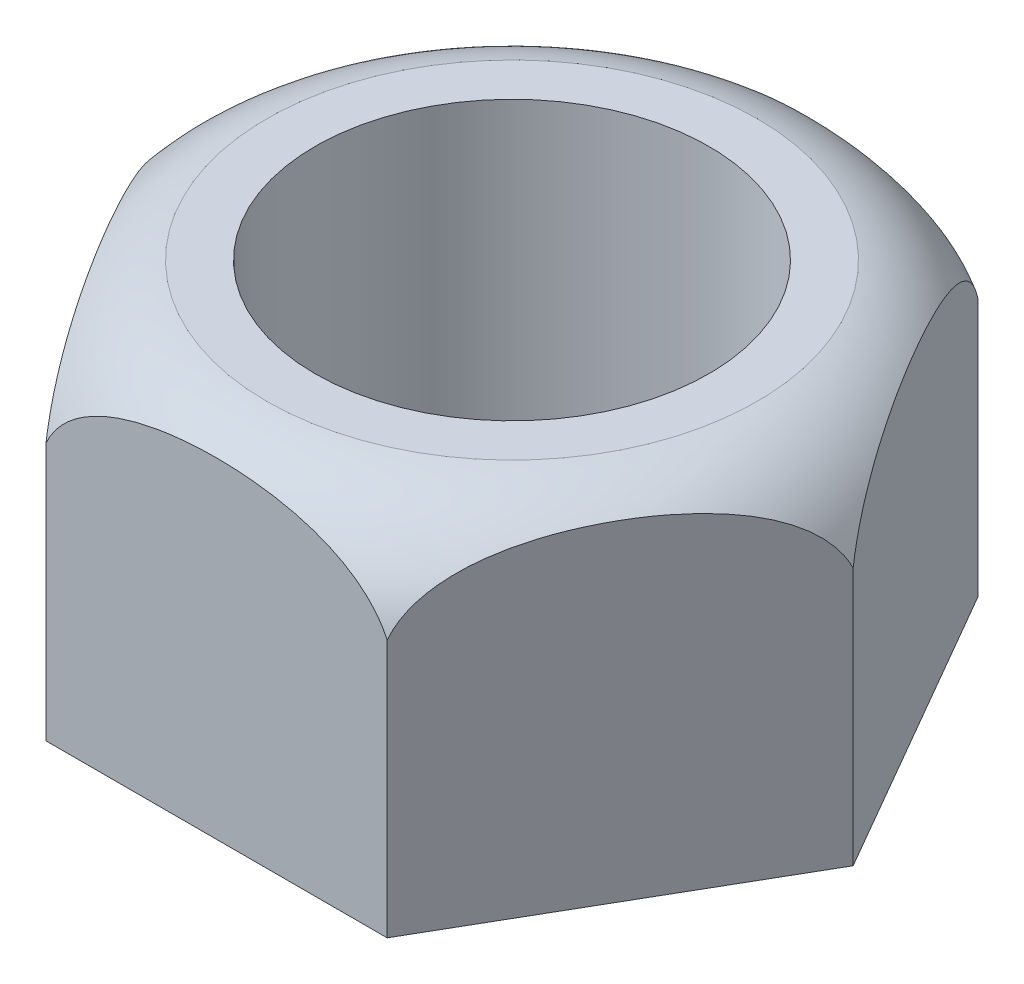
ISO-10303-21;
HEADER;
FILE_DESCRIPTION(('STEP AP214'),'2;1');
FILE_NAME('part.step','',(''),(''),'','','');
FILE_SCHEMA(('AUTOMOTIVE_DESIGN { 1 0 10303 214 1 1 1 1 }'));
ENDSEC;
DATA;
#1=APPLICATION_CONTEXT('core data for automotive mechanical design processes');
#2=APPLICATION_PROTOCOL_DEFINITION('international standard','automotive_design',2000,#1);
#3=PRODUCT_CONTEXT('',#1,'mechanical');
#4=PRODUCT('Part','Part','',(#3));
#5=PRODUCT_RELATED_PRODUCT_CATEGORY('part','',(#4));
#6=PRODUCT_DEFINITION_FORMATION('','',#4);
#7=PRODUCT_DEFINITION_CONTEXT('part definition',#1,'design');
#8=PRODUCT_DEFINITION('design','',#6,#7);
#9=PRODUCT_DEFINITION_SHAPE('','',#8);
#10=(LENGTH_UNIT() NAMED_UNIT(*) SI_UNIT(.MILLI.,.METRE.));
#11=(NAMED_UNIT(*) PLANE_ANGLE_UNIT() SI_UNIT($,.RADIAN.));
#12=(NAMED_UNIT(*) SI_UNIT($,.STERADIAN.) SOLID_ANGLE_UNIT());
#13=UNCERTAINTY_MEASURE_WITH_UNIT(LENGTH_MEASURE(1.E-05),#10,'distance_accuracy_value','');
#14=(GEOMETRIC_REPRESENTATION_CONTEXT(3) GLOBAL_UNCERTAINTY_ASSIGNED_CONTEXT((#13)) GLOBAL_UNIT_ASSIGNED_CONTEXT((#10,
#11,#12)) REPRESENTATION_CONTEXT('',''));
#15=CARTESIAN_POINT('',(0.,0.,0.));
#16=DIRECTION('',(0.,0.,1.));
#17=DIRECTION('',(1.,0.,0.));
#18=AXIS2_PLACEMENT_3D('',#15,#16,#17);
#19=CARTESIAN_POINT('',(8.24889197104677,8.55980000000001,0.));
#20=DIRECTION('',(-0.866025403784439,0.,0.5));
#21=DIRECTION('',(0.5,0.,0.866025403784439));
#22=AXIS2_PLACEMENT_3D('',#19,#20,#21);
#23=PLANE('',#22);
#24=CARTESIAN_POINT('',(8.24893575393858,6.2353386859688,7.58341931056394E-05));
#25=CARTESIAN_POINT('',(8.22543731436202,6.34284218005725,-0.0406246570520533));
#26=CARTESIAN_POINT('',(8.19665487105319,6.44500558161806,-0.0904773112289221));
#27=CARTESIAN_POINT('',(8.13104629697932,6.63684972443421,-0.204114694937019));
#28=CARTESIAN_POINT('',(8.09431397009226,6.72665757824019,-0.267736951385662));
#29=CARTESIAN_POINT('',(8.0011756518298,6.92294468194646,-0.429057250747763));
#30=CARTESIAN_POINT('',(7.94232649442226,7.0247135760561,-0.530986981360216));
#31=CARTESIAN_POINT('',(7.81719656085161,7.20888011202957,-0.747718383852292));
#32=CARTESIAN_POINT('',(7.75087802292065,7.2911721456736,-0.862585461032449));
#33=CARTESIAN_POINT('',(7.62632527114254,7.42470659858822,-1.07831715533464));
#34=CARTESIAN_POINT('',(7.56885575758391,7.47887637801377,-1.17785727270443));
#35=CARTESIAN_POINT('',(7.45176296663565,7.57705767620836,-1.38066793582684));
#36=CARTESIAN_POINT('',(7.39213829945711,7.62106249972094,-1.48394088876446));
#37=CARTESIAN_POINT('',(7.27132370311957,7.70023649655463,-1.693197907917));
#38=CARTESIAN_POINT('',(7.21013079615517,7.73538723803091,-1.79918713184217));
#39=CARTESIAN_POINT('',(7.08674468562766,7.79785403297077,-2.01289814422415));
#40=CARTESIAN_POINT('',(7.02455111380419,7.82516712903124,-2.12062057052661));
#41=CARTESIAN_POINT('',(6.84716474674997,7.89287231607991,-2.42786277083459));
#42=CARTESIAN_POINT('',(6.73118483644107,7.92507531886908,-2.62874586814686));
#43=CARTESIAN_POINT('',(6.498230529024,7.97014859052376,-3.03223456443521));
#44=CARTESIAN_POINT('',(6.38125519081207,7.98299788149749,-3.23484179345083));
#45=CARTESIAN_POINT('',(6.14725171132093,7.99091170795997,-3.6401477090774));
#46=CARTESIAN_POINT('',(6.03022368368375,7.98599020471408,-3.84284619885454));
#47=CARTESIAN_POINT('',(5.79679140375355,7.9577905849602,-4.24716276782034));
#48=CARTESIAN_POINT('',(5.68038664440031,7.93453084473649,-4.44878172526304));
#49=CARTESIAN_POINT('',(5.50917921173763,7.88435941627688,-4.74532169726819));
#50=CARTESIAN_POINT('',(5.45376667549785,7.86561150807851,-4.8412990254117));
#51=CARTESIAN_POINT('',(5.34346467364451,7.822664151612,-5.03234769679822));
#52=CARTESIAN_POINT('',(5.28857520764971,7.79846470731751,-5.12741904070155));
#53=CARTESIAN_POINT('',(5.17960339155132,7.74401975201484,-5.31616376277702));
#54=CARTESIAN_POINT('',(5.12552024708153,7.71378068141662,-5.40983851683177));
#55=CARTESIAN_POINT('',(5.01843250232996,7.64649443595172,-5.59531993160946));
#56=CARTESIAN_POINT('',(4.96542772232011,7.60944840607988,-5.68712690363053));
#57=CARTESIAN_POINT('',(4.82718703603361,7.50133527475606,-5.92656679595195));
#58=CARTESIAN_POINT('',(4.74318368815676,7.42372536292064,-6.07206486248051));
#59=CARTESIAN_POINT('',(4.58204990966602,7.24340930685432,-6.35115675364205));
#60=CARTESIAN_POINT('',(4.50491018833642,7.14073781390506,-6.48476667026669));
#61=CARTESIAN_POINT('',(4.38686599820217,6.94677531201568,-6.6892252051175));
#62=CARTESIAN_POINT('',(4.34261178651808,6.86367251031353,-6.76587574820322));
#63=CARTESIAN_POINT('',(4.26125481773306,6.68469031983388,-6.90679015168865));
#64=CARTESIAN_POINT('',(4.2241255074647,6.58886071489114,-6.97110000352344));
#65=CARTESIAN_POINT('',(4.17894908010396,6.44695017391883,-7.04934787101669));
#66=CARTESIAN_POINT('',(4.16690204315195,6.40586633669498,-7.07021395109823));
#67=CARTESIAN_POINT('',(4.1444085633627,6.32190637573708,-7.10917380093224));
#68=CARTESIAN_POINT('',(4.13396451463665,6.27902769058931,-7.12726342396249));
#69=CARTESIAN_POINT('',(4.1244022026316,6.23533868596882,-7.14382583419308));
#70=B_SPLINE_CURVE_WITH_KNOTS('',3,(#24,#25,#26,#27,#28,#29,#30,#31,#32,#33,#34,#35,#36,#37,#38,
#39,#40,#41,#42,#43,#44,#45,#46,#47,#48,#49,#50,#51,#52,#53,#54,#55,#56,#57,#58,#59,#60,#61,#62,
#63,#64,#65,#66,#67,#68,#69),.UNSPECIFIED.,.F.,.F.,(4,2,2,2,2,2,2,2,2,2,2,2,2,2,2,2,2,2,2,2,2,2,
4),(0.,0.350427425496223,0.696925865003148,1.16120912855572,1.62795495265033,2.00862154466075,
2.3895381563594,2.77124130090776,3.15308828586598,3.85455872614458,4.55678895906974,
5.25846761908035,5.95944403693531,6.29653420780221,6.63362413296263,6.97035650017381,
7.30703227758746,7.86058715263354,8.41338095029126,8.7764493662571,9.13813723410755,
9.28090011796657,9.42387419003828),.UNSPECIFIED.);
#71=CARTESIAN_POINT('',(8.24889197104677,6.23553868596881,0.));
#72=VERTEX_POINT('',#71);
#73=CARTESIAN_POINT('',(4.12444598552338,6.23553868596882,-7.14375));
#74=VERTEX_POINT('',#73);
#75=EDGE_CURVE('E104',#72,#74,#70,.T.);
#76=ORIENTED_EDGE('',*,*,#75,.F.);
#77=DIRECTION('',(0.,-1.,0.));
#78=VECTOR('',#77,1.);
#79=CARTESIAN_POINT('',(8.24889197104677,8.55980000000001,0.));
#80=LINE('',#79,#78);
#81=CARTESIAN_POINT('',(8.24889197104677,0.,0.));
#82=VERTEX_POINT('',#81);
#83=EDGE_CURVE('E76',#72,#82,#80,.T.);
#84=ORIENTED_EDGE('',*,*,#83,.T.);
#85=DIRECTION('',(-0.5,0.,-0.866025403784439));
#86=VECTOR('',#85,1.);
#87=CARTESIAN_POINT('',(8.24889197104677,0.,0.));
#88=LINE('',#87,#86);
#89=CARTESIAN_POINT('',(4.12444598552339,0.,-7.14375));
#90=VERTEX_POINT('',#89);
#91=EDGE_CURVE('E121',#82,#90,#88,.T.);
#92=ORIENTED_EDGE('',*,*,#91,.T.);
#93=DIRECTION('',(0.,-1.,0.));
#94=VECTOR('',#93,1.);
#95=CARTESIAN_POINT('',(4.12444598552339,8.55980000000001,-7.14375000000002));
#96=LINE('',#95,#94);
#97=EDGE_CURVE('E13',#74,#90,#96,.T.);
#98=ORIENTED_EDGE('',*,*,#97,.F.);
#99=EDGE_LOOP('',(#76,#84,#92,#98));
#100=FACE_BOUND('',#99,.T.);
#101=ADVANCED_FACE('F53',(#100),#23,.F.);
#102=CARTESIAN_POINT('',(4.12444598552339,8.55980000000001,-7.14375000000002));
#103=DIRECTION('',(0.,0.,1.));
#104=DIRECTION('',(1.,0.,0.));
#105=AXIS2_PLACEMENT_3D('',#102,#103,#104);
#106=PLANE('',#105);
#107=CARTESIAN_POINT('',(0.,7.98826677982349,-7.14374999999999));
#108=CARTESIAN_POINT('',(-0.187450549647373,7.98826978687154,-7.14374999999999));
#109=CARTESIAN_POINT('',(-0.374910324300697,7.98256531091271,-7.14375000000001));
#110=CARTESIAN_POINT('',(-0.749187788216499,7.95928749417737,-7.14375000000002));
#111=CARTESIAN_POINT('',(-0.936005171621026,7.94170912331662,-7.14375000000002));
#112=CARTESIAN_POINT('',(-1.30728057161959,7.89336853579566,-7.14375000000002));
#113=CARTESIAN_POINT('',(-1.49174469606105,7.86265447480424,-7.14375000000002));
#114=CARTESIAN_POINT('',(-1.8573336101827,7.78576768336265,-7.14375000000001));
#115=CARTESIAN_POINT('',(-2.03846155151695,7.7396104254909,-7.14375));
#116=CARTESIAN_POINT('',(-2.37670748942257,7.63427716984391,-7.14375000000001));
#117=CARTESIAN_POINT('',(-2.53438205129545,7.57692306257758,-7.14375000000002));
#118=CARTESIAN_POINT('',(-2.84233957711975,7.44406885307009,-7.14375000000002));
#119=CARTESIAN_POINT('',(-2.99261270246027,7.36854534317949,-7.14375));
#120=CARTESIAN_POINT('',(-3.28272071815591,7.19489089457452,-7.14375000000001));
#121=CARTESIAN_POINT('',(-3.42237544590105,7.09645188243693,-7.14375000000002));
#122=CARTESIAN_POINT('',(-3.6803274105844,6.87471285879841,-7.14375000000001));
#123=CARTESIAN_POINT('',(-3.79871170680939,6.75151877260037,-7.14374999999998));
#124=CARTESIAN_POINT('',(-3.96034644709604,6.53640293720515,-7.14375));
#125=CARTESIAN_POINT('',(-4.01442687780075,6.45260243686396,-7.14375000000002));
#126=CARTESIAN_POINT('',(-4.10845933792733,6.27734934664688,-7.14375000000002));
#127=CARTESIAN_POINT('',(-4.14842022162116,6.1859015969683,-7.14374999999999));
#128=CARTESIAN_POINT('',(-4.21175763921705,5.99661067114806,-7.14374999999999));
#129=CARTESIAN_POINT('',(-4.23501192779827,5.89872596196194,-7.14375000000001));
#130=CARTESIAN_POINT('',(-4.26253096229258,5.70031535148988,-7.14375000000002));
#131=CARTESIAN_POINT('',(-4.26680559455275,5.59979085270586,-7.14375000000002));
#132=CARTESIAN_POINT('',(-4.25659283454024,5.41025176749444,-7.14375000000002));
#133=CARTESIAN_POINT('',(-4.24401087139935,5.32112764040986,-7.14375000000002));
#134=CARTESIAN_POINT('',(-4.20423516607436,5.14623201998094,-7.14375000000001));
#135=CARTESIAN_POINT('',(-4.17704028962077,5.06046078744623,-7.14374999999999));
#136=CARTESIAN_POINT('',(-4.10923582708162,4.89304123010996,-7.14374999999999));
#137=CARTESIAN_POINT('',(-4.06844154483803,4.81146858518673,-7.14375000000002));
#138=CARTESIAN_POINT('',(-3.97568924339239,4.65499212726519,-7.14375000000002));
#139=CARTESIAN_POINT('',(-3.9237259154134,4.58009150958824,-7.14375));
#140=CARTESIAN_POINT('',(-3.78063651602825,4.39952039055839,-7.14374999999998));
#141=CARTESIAN_POINT('',(-3.68338739957913,4.29869313102764,-7.14375000000001));
#142=CARTESIAN_POINT('',(-3.47412454834483,4.11379710595111,-7.14375000000002));
#143=CARTESIAN_POINT('',(-3.36207605957143,4.02976899572282,-7.14375));
#144=CARTESIAN_POINT('',(-3.0627288839129,3.83438357702667,-7.14374999999998));
#145=CARTESIAN_POINT('',(-2.86832437870103,3.7339344685416,-7.14375000000001));
#146=CARTESIAN_POINT('',(-2.56751107791536,3.60600198096798,-7.14375000000002));
#147=CARTESIAN_POINT('',(-2.46554071511294,3.56710556082647,-7.14375000000002));
#148=CARTESIAN_POINT('',(-2.25926239304128,3.49607082452517,-7.14375000000001));
#149=CARTESIAN_POINT('',(-2.15495491765644,3.46393112347844,-7.14375000000001));
#150=CARTESIAN_POINT('',(-1.85646165034079,3.38121509380417,-7.14375));
#151=CARTESIAN_POINT('',(-1.66029689436215,3.33779621306887,-7.14375000000001));
#152=CARTESIAN_POINT('',(-1.2649531223277,3.26761827499379,-7.14375000000002));
#153=CARTESIAN_POINT('',(-1.06577140977583,3.24087514699284,-7.14375000000002));
#154=CARTESIAN_POINT('',(-0.665398863769086,3.2016647578887,-7.14375000000002));
#155=CARTESIAN_POINT('',(-0.464203644380809,3.18924338203855,-7.14375000000002));
#156=CARTESIAN_POINT('',(-0.061535691626735,3.17767545177597,-7.14375000000001));
#157=CARTESIAN_POINT('',(0.139936868343673,3.17852270307074,-7.14375));
#158=CARTESIAN_POINT('',(0.514673778480569,3.19253465283143,-7.14375000000001));
#159=CARTESIAN_POINT('',(0.68800269309396,3.20398739178078,-7.14375000000001));
#160=CARTESIAN_POINT('',(1.03369925188393,3.23762832251236,-7.14375000000002));
#161=CARTESIAN_POINT('',(1.20606657860937,3.25981986928367,-7.14375000000002));
#162=CARTESIAN_POINT('',(1.54794259280948,3.31626993935381,-7.14375000000002));
#163=CARTESIAN_POINT('',(1.71746145081384,3.35046549974604,-7.14375000000002));
#164=CARTESIAN_POINT('',(2.0529284063107,3.43306104826712,-7.14375000000001));
#165=CARTESIAN_POINT('',(2.21887965055034,3.48144791692585,-7.14375));
#166=CARTESIAN_POINT('',(2.53511701799457,3.5918270786776,-7.14375000000001));
#167=CARTESIAN_POINT('',(2.68574426303233,3.65282270707492,-7.14375000000002));
#168=CARTESIAN_POINT('',(2.97890903777817,3.79282718602654,-7.14375000000001));
#169=CARTESIAN_POINT('',(3.12143244985582,3.8718663374456,-7.14374999999999));
#170=CARTESIAN_POINT('',(3.39502946720028,4.05220229060833,-7.14374999999999));
#171=CARTESIAN_POINT('',(3.52590055724988,4.15381352798369,-7.14375000000002));
#172=CARTESIAN_POINT('',(3.76506602463691,4.38079457551077,-7.14375000000001));
#173=CARTESIAN_POINT('',(3.8734581924831,4.50605674493859,-7.14374999999998));
#174=CARTESIAN_POINT('',(4.01887497456291,4.72320904000138,-7.14375));
#175=CARTESIAN_POINT('',(4.06694109544633,4.8077312051497,-7.14375000000002));
#176=CARTESIAN_POINT('',(4.14871857694964,4.98351334409123,-7.14375000000002));
#177=CARTESIAN_POINT('',(4.18243906802213,5.07476898874272,-7.14374999999999));
#178=CARTESIAN_POINT('',(4.23336649612648,5.26243902257045,-7.14374999999999));
#179=CARTESIAN_POINT('',(4.25047167383781,5.35888142992725,-7.14375000000001));
#180=CARTESIAN_POINT('',(4.26641678303021,5.55326868590939,-7.14375000000003));
#181=CARTESIAN_POINT('',(4.26526260562955,5.65121303976491,-7.14375000000003));
#182=CARTESIAN_POINT('',(4.24572907120983,5.83650792205007,-7.14375000000003));
#183=CARTESIAN_POINT('',(4.22888879467324,5.92402669823055,-7.14375000000002));
#184=CARTESIAN_POINT('',(4.18129073440122,6.09516135910205,-7.14375000000001));
#185=CARTESIAN_POINT('',(4.15053093874884,6.17877667766217,-7.14375000000002));
#186=CARTESIAN_POINT('',(4.07539142344497,6.34364223001864,-7.14375000000002));
#187=CARTESIAN_POINT('',(4.03051676584605,6.4246645975472,-7.14375000000002));
#188=CARTESIAN_POINT('',(3.92990596289553,6.57959828401815,-7.14375000000001));
#189=CARTESIAN_POINT('',(3.87416475750376,6.65350626608334,-7.14375000000001));
#190=CARTESIAN_POINT('',(3.71928067002685,6.8343212868521,-7.14375));
#191=CARTESIAN_POINT('',(3.6136481874203,6.9356744119349,-7.14375000000001));
#192=CARTESIAN_POINT('',(3.38766084845949,7.12044414580638,-7.14375000000002));
#193=CARTESIAN_POINT('',(3.26726683276439,7.20381135331698,-7.14375000000002));
#194=CARTESIAN_POINT('',(3.04258397701966,7.33888254375397,-7.14375000000002));
#195=CARTESIAN_POINT('',(2.94005071009194,7.39357416394237,-7.14375000000002));
#196=CARTESIAN_POINT('',(2.73057206469072,7.49383522356814,-7.14375000000002));
#197=CARTESIAN_POINT('',(2.6236239034841,7.53939880030518,-7.14375000000002));
#198=CARTESIAN_POINT('',(2.40654432821649,7.62244934455349,-7.14375000000002));
#199=CARTESIAN_POINT('',(2.29640966989799,7.65992772681686,-7.14375000000003));
#200=CARTESIAN_POINT('',(2.0739415491051,7.72770241593209,-7.14375000000001));
#201=CARTESIAN_POINT('',(1.96160742633742,7.75799652909132,-7.14374999999998));
#202=CARTESIAN_POINT('',(1.69762143901033,7.82127208433199,-7.14374999999997));
#203=CARTESIAN_POINT('',(1.54537565519149,7.85176833260344,-7.14375000000001));
#204=CARTESIAN_POINT('',(1.2392445544688,7.90296896695416,-7.14375000000003));
#205=CARTESIAN_POINT('',(1.08535878328987,7.92367056382813,-7.14375000000002));
#206=CARTESIAN_POINT('',(0.776423707731591,7.95639447172694,-7.14375000000002));
#207=CARTESIAN_POINT('',(0.621372902542476,7.96840240645042,-7.14375000000002));
#208=CARTESIAN_POINT('',(0.310883487472762,7.98433693201041,-7.14375000000001));
#209=CARTESIAN_POINT('',(0.155444915612855,7.98826428620408,-7.14374999999999));
#210=CARTESIAN_POINT('',(0.,7.98826677982349,-7.14374999999999));
#211=B_SPLINE_CURVE_WITH_KNOTS('',3,(#107,#108,#109,#110,#111,#112,#113,#114,#115,#116,#117,
#118,#119,#120,#121,#122,#123,#124,#125,#126,#127,#128,#129,#130,#131,#132,#133,#134,#135,#136,
#137,#138,#139,#140,#141,#142,#143,#144,#145,#146,#147,#148,#149,#150,#151,#152,#153,#154,#155,
#156,#157,#158,#159,#160,#161,#162,#163,#164,#165,#166,#167,#168,#169,#170,#171,#172,#173,#174,
#175,#176,#177,#178,#179,#180,#181,#182,#183,#184,#185,#186,#187,#188,#189,#190,#191,#192,#193,
#194,#195,#196,#197,#198,#199,#200,#201,#202,#203,#204,#205,#206,#207,#208,#209,#210),
.UNSPECIFIED.,.T.,.F.,(4,2,2,2,2,2,2,2,2,2,2,2,2,2,2,2,2,2,2,2,2,2,2,2,2,2,2,2,2,2,2,2,2,2,2,2,
2,2,2,2,2,2,2,2,2,2,2,2,2,2,2,4),(0.,0.562276773874726,1.12479189201568,1.68526226253245,
2.2451727695548,2.74762945260232,3.25073695023035,3.76104456888429,4.26921341232884,
4.56733824855503,4.86527579952955,5.16537180666401,5.46531147790057,5.73405049235294,
6.00281036962016,6.27538006550789,6.54807960456275,6.96593412037132,7.38478795271826,
8.03732795384406,8.36461168650558,8.69182827210727,9.29359771444631,9.89594111368379,
10.5002090360968,11.1041948719927,11.6250223461323,12.1460126409254,12.6643101157375,
13.1821299411963,13.6687167456039,14.1561267760512,14.6508076441783,15.1432891297037,
15.4338963387268,15.7243183094967,16.016507940147,16.3086033019393,16.5747541716581,
16.840943522919,17.1177651044929,17.3947158980907,17.8314050938777,18.2692788742151,
18.617420458891,18.9657849338277,19.3145175177455,19.6633564492839,20.1287725950262,
20.5943211968381,21.0606379069887,21.5269105630596),.UNSPECIFIED.);
#212=CARTESIAN_POINT('',(-4.12444598552338,6.23553868596882,-7.14374999999999));
#213=VERTEX_POINT('',#212);
#214=EDGE_CURVE('E107',#74,#213,#211,.T.);
#215=ORIENTED_EDGE('',*,*,#214,.F.);
#216=ORIENTED_EDGE('',*,*,#97,.T.);
#217=DIRECTION('',(-1.,0.,0.));
#218=VECTOR('',#217,1.);
#219=CARTESIAN_POINT('',(4.12444598552339,0.,-7.14375));
#220=LINE('',#219,#218);
#221=CARTESIAN_POINT('',(-4.12444598552338,0.,-7.14374999999999));
#222=VERTEX_POINT('',#221);
#223=EDGE_CURVE('E124',#90,#222,#220,.T.);
#224=ORIENTED_EDGE('',*,*,#223,.T.);
#225=DIRECTION('',(0.,-1.,0.));
#226=VECTOR('',#225,1.);
#227=CARTESIAN_POINT('',(-4.12444598552339,8.55980000000001,-7.14374999999999));
#228=LINE('',#227,#226);
#229=EDGE_CURVE('E61',#213,#222,#228,.T.);
#230=ORIENTED_EDGE('',*,*,#229,.F.);
#231=EDGE_LOOP('',(#215,#216,#224,#230));
#232=FACE_BOUND('',#231,.T.);
#233=ADVANCED_FACE('F115',(#232),#106,.F.);
#234=CARTESIAN_POINT('',(-4.12444598552339,8.55980000000001,-7.14374999999999));
#235=DIRECTION('',(0.866025403784439,0.,0.5));
#236=DIRECTION('',(0.5,0.,-0.866025403784439));
#237=AXIS2_PLACEMENT_3D('',#234,#235,#236);
#238=PLANE('',#237);
#239=CARTESIAN_POINT('',(-4.1244022026316,6.23533868596882,-7.1438258341931));
#240=CARTESIAN_POINT('',(-4.14790064220815,6.34284218005723,-7.1031253429479));
#241=CARTESIAN_POINT('',(-4.17668308551697,6.44500558161804,-7.05327268877104));
#242=CARTESIAN_POINT('',(-4.24229165959083,6.63684972443421,-6.93963530506298));
#243=CARTESIAN_POINT('',(-4.2790239864779,6.72665757824021,-6.87601304861438));
#244=CARTESIAN_POINT('',(-4.37216230474035,6.92294468194647,-6.71469274925229));
#245=CARTESIAN_POINT('',(-4.43101146214789,7.02471357605608,-6.6127630186398));
#246=CARTESIAN_POINT('',(-4.55614139571853,7.20888011202955,-6.39603161614771));
#247=CARTESIAN_POINT('',(-4.62245993364952,7.2911721456736,-6.28116453896758));
#248=CARTESIAN_POINT('',(-4.74701268542762,7.42470659858822,-6.0654328446654));
#249=CARTESIAN_POINT('',(-4.80448219898623,7.47887637801375,-5.96589272729559));
#250=CARTESIAN_POINT('',(-4.92157498993449,7.57705767620834,-5.76308206417317));
#251=CARTESIAN_POINT('',(-4.98119965711303,7.62106249972092,-5.65980911123556));
#252=CARTESIAN_POINT('',(-5.10201425345057,7.70023649655462,-5.45055209208301));
#253=CARTESIAN_POINT('',(-5.16320716041496,7.73538723803089,-5.34456286815784));
#254=CARTESIAN_POINT('',(-5.28659327094248,7.79785403297076,-5.13085185577587));
#255=CARTESIAN_POINT('',(-5.34878684276597,7.82516712903124,-5.02312942947342));
#256=CARTESIAN_POINT('',(-5.52617320982019,7.89287231607991,-4.71588722916544));
#257=CARTESIAN_POINT('',(-5.64215312012908,7.92507531886907,-4.51500413185316));
#258=CARTESIAN_POINT('',(-5.87510742754613,7.97014859052375,-4.1115154355648));
#259=CARTESIAN_POINT('',(-5.99208276575807,7.98299788149748,-3.90890820654917));
#260=CARTESIAN_POINT('',(-6.22608624524922,7.99091170795997,-3.5036022909226));
#261=CARTESIAN_POINT('',(-6.34311427288638,7.98599020471407,-3.30090380114545));
#262=CARTESIAN_POINT('',(-6.57654655281662,7.95779058496019,-2.89658723217966));
#263=CARTESIAN_POINT('',(-6.6929513121699,7.9345308447365,-2.69496827473697));
#264=CARTESIAN_POINT('',(-6.86415874483256,7.88435941627688,-2.39842830273181));
#265=CARTESIAN_POINT('',(-6.91957128107232,7.86561150807851,-2.30245097458829));
#266=CARTESIAN_POINT('',(-7.02987328292564,7.82266415161199,-2.11140230320176));
#267=CARTESIAN_POINT('',(-7.08476274892045,7.7984647073175,-2.01633095929843));
#268=CARTESIAN_POINT('',(-7.19373456501884,7.74401975201483,-1.82758623722297));
#269=CARTESIAN_POINT('',(-7.24781770948862,7.71378068141661,-1.73391148316822));
#270=CARTESIAN_POINT('',(-7.35490545424019,7.64649443595172,-1.54843006839052));
#271=CARTESIAN_POINT('',(-7.40791023425004,7.60944840607988,-1.45662309636946));
#272=CARTESIAN_POINT('',(-7.54615092053655,7.50133527475606,-1.21718320404804));
#273=CARTESIAN_POINT('',(-7.63015426841337,7.42372536292063,-1.07168513751948));
#274=CARTESIAN_POINT('',(-7.79128804690414,7.24340930685431,-0.792593246357952));
#275=CARTESIAN_POINT('',(-7.86842776823378,7.14073781390505,-0.658983329733329));
#276=CARTESIAN_POINT('',(-7.986471958368,6.94677531201565,-0.454524794882514));
#277=CARTESIAN_POINT('',(-8.03072617005206,6.86367251031349,-0.377874251796786));
#278=CARTESIAN_POINT('',(-8.11208313883711,6.68469031983386,-0.236959848311315));
#279=CARTESIAN_POINT('',(-8.14921244910552,6.58886071489116,-0.172649996476486));
#280=CARTESIAN_POINT('',(-8.19438887646622,6.44695017391881,-0.0944021289832702));
#281=CARTESIAN_POINT('',(-8.20643591341821,6.40586633669495,-0.0735360489017477));
#282=CARTESIAN_POINT('',(-8.22892939320744,6.32190637573705,-0.0345761990677584));
#283=CARTESIAN_POINT('',(-8.2393734419335,6.27902769058928,-0.0164865760375078));
#284=CARTESIAN_POINT('',(-8.24893575393861,6.23533868596882,7.58341931195172E-05));
#285=B_SPLINE_CURVE_WITH_KNOTS('',3,(#239,#240,#241,#242,#243,#244,#245,#246,#247,#248,#249,
#250,#251,#252,#253,#254,#255,#256,#257,#258,#259,#260,#261,#262,#263,#264,#265,#266,#267,#268,
#269,#270,#271,#272,#273,#274,#275,#276,#277,#278,#279,#280,#281,#282,#283,#284),.UNSPECIFIED.,
.F.,.F.,(4,2,2,2,2,2,2,2,2,2,2,2,2,2,2,2,2,2,2,2,2,2,4),(0.,0.350427425496208,0.69692586500311,
1.16120912855568,1.62795495265029,2.0086215446607,2.38953815635936,2.77124130090772,
3.15308828586594,3.85455872614454,4.55678895906971,5.25846761908034,5.9594440369353,
6.29653420780221,6.63362413296263,6.9703565001738,7.30703227758745,7.86058715263352,
8.41338095029124,8.7764493662571,9.13813723410758,9.28090011796659,9.42387419003828),.UNSPECIFIED.);
#286=CARTESIAN_POINT('',(-8.24889197104679,6.23553868596881,0.));
#287=VERTEX_POINT('',#286);
#288=EDGE_CURVE('E118',#213,#287,#285,.T.);
#289=ORIENTED_EDGE('',*,*,#288,.F.);
#290=ORIENTED_EDGE('',*,*,#229,.T.);
#291=DIRECTION('',(-0.5,0.,0.866025403784439));
#292=VECTOR('',#291,1.);
#293=CARTESIAN_POINT('',(-4.12444598552338,0.,-7.14374999999999));
#294=LINE('',#293,#292);
#295=CARTESIAN_POINT('',(-8.24889197104678,0.,0.));
#296=VERTEX_POINT('',#295);
#297=EDGE_CURVE('E127',#222,#296,#294,.T.);
#298=ORIENTED_EDGE('',*,*,#297,.T.);
#299=DIRECTION('',(0.,-1.,0.));
#300=VECTOR('',#299,1.);
#301=CARTESIAN_POINT('',(-8.24889197104679,8.55980000000001,0.));
#302=LINE('',#301,#300);
#303=EDGE_CURVE('E148',#287,#296,#302,.T.);
#304=ORIENTED_EDGE('',*,*,#303,.F.);
#305=EDGE_LOOP('',(#289,#290,#298,#304));
#306=FACE_BOUND('',#305,.T.);
#307=ADVANCED_FACE('F150',(#306),#238,.F.);
#308=CARTESIAN_POINT('',(-8.24889197104679,8.55980000000001,0.));
#309=DIRECTION('',(0.86602540378444,0.,-0.500000000000001));
#310=DIRECTION('',(-0.500000000000001,0.,-0.86602540378444));
#311=AXIS2_PLACEMENT_3D('',#308,#309,#310);
#312=PLANE('',#311);
#313=CARTESIAN_POINT('',(-8.24893575393859,6.2353386859688,-7.58341930640061E-05));
#314=CARTESIAN_POINT('',(-8.22543731436202,6.34284218005723,0.0406246570521057));
#315=CARTESIAN_POINT('',(-8.19665487105318,6.44500558161804,0.090477311228966));
#316=CARTESIAN_POINT('',(-8.13104629697933,6.6368497244342,0.204114694937039));
#317=CARTESIAN_POINT('',(-8.09431397009228,6.72665757824019,0.267736951385666));
#318=CARTESIAN_POINT('',(-8.00117565182983,6.92294468194646,0.429057250747758));
#319=CARTESIAN_POINT('',(-7.94232649442228,7.02471357605606,0.530986981360229));
#320=CARTESIAN_POINT('',(-7.81719656085163,7.20888011202954,0.747718383852288));
#321=CARTESIAN_POINT('',(-7.75087802292066,7.2911721456736,0.862585461032413));
#322=CARTESIAN_POINT('',(-7.62632527114257,7.42470659858822,1.0783171553346));
#323=CARTESIAN_POINT('',(-7.56885575758394,7.47887637801374,1.1778572727044));
#324=CARTESIAN_POINT('',(-7.45176296663568,7.57705767620832,1.38066793582682));
#325=CARTESIAN_POINT('',(-7.39213829945715,7.62106249972091,1.48394088876443));
#326=CARTESIAN_POINT('',(-7.27132370311961,7.70023649655461,1.69319790791698));
#327=CARTESIAN_POINT('',(-7.21013079615521,7.73538723803088,1.79918713184215));
#328=CARTESIAN_POINT('',(-7.08674468562769,7.79785403297075,2.01289814422412));
#329=CARTESIAN_POINT('',(-7.02455111380421,7.82516712903123,2.12062057052657));
#330=CARTESIAN_POINT('',(-6.84716474674999,7.89287231607992,2.42786277083454));
#331=CARTESIAN_POINT('',(-6.7311848364411,7.92507531886907,2.62874586814682));
#332=CARTESIAN_POINT('',(-6.49823052902404,7.97014859052373,3.03223456443518));
#333=CARTESIAN_POINT('',(-6.38125519081211,7.98299788149747,3.23484179345081));
#334=CARTESIAN_POINT('',(-6.14725171132096,7.99091170795996,3.64014770907737));
#335=CARTESIAN_POINT('',(-6.03022368368379,7.98599020471406,3.84284619885452));
#336=CARTESIAN_POINT('',(-5.79679140375357,7.95779058496019,4.24716276782032));
#337=CARTESIAN_POINT('',(-5.68038664440031,7.9345308447365,4.44878172526301));
#338=CARTESIAN_POINT('',(-5.50917921173764,7.88435941627688,4.74532169726817));
#339=CARTESIAN_POINT('',(-5.45376667549788,7.86561150807851,4.84129902541169));
#340=CARTESIAN_POINT('',(-5.34346467364454,7.82266415161198,5.03234769679821));
#341=CARTESIAN_POINT('',(-5.28857520764974,7.7984647073175,5.12741904070155));
#342=CARTESIAN_POINT('',(-5.17960339155134,7.74401975201483,5.31616376277702));
#343=CARTESIAN_POINT('',(-5.12552024708155,7.7137806814166,5.40983851683177));
#344=CARTESIAN_POINT('',(-5.01843250232998,7.64649443595171,5.59531993160948));
#345=CARTESIAN_POINT('',(-4.96542772232014,7.60944840607988,5.68712690363056));
#346=CARTESIAN_POINT('',(-4.82718703603365,7.50133527475607,5.92656679595197));
#347=CARTESIAN_POINT('',(-4.7431836881568,7.42372536292063,6.07206486248051));
#348=CARTESIAN_POINT('',(-4.58204990966605,7.2434093068543,6.35115675364202));
#349=CARTESIAN_POINT('',(-4.50491018833643,7.14073781390505,6.48476667026665));
#350=CARTESIAN_POINT('',(-4.38686599820219,6.94677531201567,6.68922520511746));
#351=CARTESIAN_POINT('',(-4.34261178651811,6.86367251031352,6.76587574820318));
#352=CARTESIAN_POINT('',(-4.26125481773309,6.68469031983387,6.90679015168867));
#353=CARTESIAN_POINT('',(-4.22412550746473,6.58886071489117,6.97110000352351));
#354=CARTESIAN_POINT('',(-4.17894908010399,6.44695017391882,7.04934787101672));
#355=CARTESIAN_POINT('',(-4.16690204315198,6.40586633669496,7.07021395109823));
#356=CARTESIAN_POINT('',(-4.14440856336273,6.32190637573705,7.10917380093222));
#357=CARTESIAN_POINT('',(-4.13396451463667,6.27902769058928,7.12726342396248));
#358=CARTESIAN_POINT('',(-4.12440220263161,6.23533868596882,7.14382583419312));
#359=B_SPLINE_CURVE_WITH_KNOTS('',3,(#313,#314,#315,#316,#317,#318,#319,#320,#321,#322,#323,
#324,#325,#326,#327,#328,#329,#330,#331,#332,#333,#334,#335,#336,#337,#338,#339,#340,#341,#342,
#343,#344,#345,#346,#347,#348,#349,#350,#351,#352,#353,#354,#355,#356,#357,#358),.UNSPECIFIED.,
.F.,.F.,(4,2,2,2,2,2,2,2,2,2,2,2,2,2,2,2,2,2,2,2,2,2,4),(0.,0.350427425496212,0.696925865003123,
1.16120912855567,1.62795495265027,2.00862154466068,2.38953815635933,2.77124130090769,
3.15308828586592,3.85455872614451,4.55678895906967,5.25846761908029,5.95944403693525,
6.29653420780216,6.6336241329626,6.97035650017378,7.30703227758744,7.86058715263349,
8.41338095029119,8.77644936625705,9.13813723410752,9.28090011796654,9.42387419003825),.UNSPECIFIED.);
#360=CARTESIAN_POINT('',(-4.1244459855234,6.23553868596881,7.14375000000003));
#361=VERTEX_POINT('',#360);
#362=EDGE_CURVE('E160',#287,#361,#359,.T.);
#363=ORIENTED_EDGE('',*,*,#362,.F.);
#364=ORIENTED_EDGE('',*,*,#303,.T.);
#365=DIRECTION('',(0.500000000000001,0.,0.86602540378444));
#366=VECTOR('',#365,1.);
#367=CARTESIAN_POINT('',(-8.24889197104678,0.,0.));
#368=LINE('',#367,#366);
#369=CARTESIAN_POINT('',(-4.12444598552341,0.,7.14375000000003));
#370=VERTEX_POINT('',#369);
#371=EDGE_CURVE('E135',#296,#370,#368,.T.);
#372=ORIENTED_EDGE('',*,*,#371,.T.);
#373=DIRECTION('',(0.,-1.,0.));
#374=VECTOR('',#373,1.);
#375=CARTESIAN_POINT('',(-4.1244459855234,8.55980000000001,7.14375000000003));
#376=LINE('',#375,#374);
#377=EDGE_CURVE('E146',#361,#370,#376,.T.);
#378=ORIENTED_EDGE('',*,*,#377,.F.);
#379=EDGE_LOOP('',(#363,#364,#372,#378));
#380=FACE_BOUND('',#379,.T.);
#381=ADVANCED_FACE('F159',(#380),#312,.F.);
#382=CARTESIAN_POINT('',(-4.1244459855234,8.55980000000001,7.14375000000003));
#383=DIRECTION('',(0.,0.,-1.));
#384=DIRECTION('',(-1.,0.,0.));
#385=AXIS2_PLACEMENT_3D('',#382,#383,#384);
#386=PLANE('',#385);
#387=CARTESIAN_POINT('',(0.,7.98826677982349,7.14375));
#388=CARTESIAN_POINT('',(0.18745054964738,7.98826978687154,7.14375));
#389=CARTESIAN_POINT('',(0.374910324300704,7.9825653109127,7.14375000000002));
#390=CARTESIAN_POINT('',(0.749187788216507,7.95928749417736,7.14375000000004));
#391=CARTESIAN_POINT('',(0.936005171621035,7.94170912331661,7.14375000000003));
#392=CARTESIAN_POINT('',(1.3072805716196,7.89336853579564,7.14375000000003));
#393=CARTESIAN_POINT('',(1.49174469606107,7.86265447480423,7.14375000000004));
#394=CARTESIAN_POINT('',(1.85733361018272,7.78576768336264,7.14375000000002));
#395=CARTESIAN_POINT('',(2.03846155151698,7.73961042549091,7.14375));
#396=CARTESIAN_POINT('',(2.37670748942259,7.6342771698439,7.14375000000001));
#397=CARTESIAN_POINT('',(2.53438205129546,7.57692306257755,7.14375000000004));
#398=CARTESIAN_POINT('',(2.84233957711977,7.44406885307007,7.14375000000002));
#399=CARTESIAN_POINT('',(2.9926127024603,7.36854534317949,7.14374999999996));
#400=CARTESIAN_POINT('',(3.28272071815594,7.19489089457452,7.14374999999996));
#401=CARTESIAN_POINT('',(3.42237544590105,7.09645188243691,7.14375000000002));
#402=CARTESIAN_POINT('',(3.68032741058439,6.87471285879838,7.14375000000004));
#403=CARTESIAN_POINT('',(3.79871170680939,6.75151877260037,7.14375));
#404=CARTESIAN_POINT('',(3.96034644709602,6.53640293720515,7.14375000000001));
#405=CARTESIAN_POINT('',(4.01442687780073,6.45260243686396,7.14375000000003));
#406=CARTESIAN_POINT('',(4.10845933792731,6.27734934664688,7.14375000000003));
#407=CARTESIAN_POINT('',(4.14842022162115,6.1859015969683,7.14375));
#408=CARTESIAN_POINT('',(4.21175763921702,5.99661067114806,7.14375));
#409=CARTESIAN_POINT('',(4.23501192779824,5.89872596196194,7.14375000000003));
#410=CARTESIAN_POINT('',(4.26253096229256,5.70031535148988,7.14375000000003));
#411=CARTESIAN_POINT('',(4.26680559455277,5.59979085270586,7.14375));
#412=CARTESIAN_POINT('',(4.25659283454026,5.41025176749444,7.14375000000001));
#413=CARTESIAN_POINT('',(4.24401087139933,5.32112764040987,7.14375000000003));
#414=CARTESIAN_POINT('',(4.20423516607432,5.14623201998094,7.14375000000003));
#415=CARTESIAN_POINT('',(4.17704028962076,5.06046078744623,7.14375000000001));
#416=CARTESIAN_POINT('',(4.10923582708162,4.89304123010996,7.14375));
#417=CARTESIAN_POINT('',(4.06844154483801,4.81146858518674,7.14375000000003));
#418=CARTESIAN_POINT('',(3.97568924339236,4.6549921272652,7.14375000000003));
#419=CARTESIAN_POINT('',(3.92372591541338,4.58009150958824,7.14375000000001));
#420=CARTESIAN_POINT('',(3.78063651602825,4.39952039055839,7.14374999999999));
#421=CARTESIAN_POINT('',(3.68338739957912,4.29869313102766,7.14375000000002));
#422=CARTESIAN_POINT('',(3.47412454834483,4.11379710595113,7.14375000000004));
#423=CARTESIAN_POINT('',(3.36207605957146,4.02976899572281,7.14375000000002));
#424=CARTESIAN_POINT('',(3.06272888391294,3.83438357702665,7.14375000000001));
#425=CARTESIAN_POINT('',(2.86832437870104,3.73393446854161,7.14375000000003));
#426=CARTESIAN_POINT('',(2.56751107791536,3.606001980968,7.14375000000004));
#427=CARTESIAN_POINT('',(2.46554071511294,3.56710556082649,7.14375000000004));
#428=CARTESIAN_POINT('',(2.25926239304128,3.49607082452518,7.14375000000003));
#429=CARTESIAN_POINT('',(2.15495491765644,3.46393112347844,7.14375000000002));
#430=CARTESIAN_POINT('',(1.85646165034079,3.38121509380416,7.14375000000001));
#431=CARTESIAN_POINT('',(1.66029689436214,3.33779621306888,7.14375000000003));
#432=CARTESIAN_POINT('',(1.26495312232769,3.26761827499381,7.14375000000004));
#433=CARTESIAN_POINT('',(1.06577140977582,3.24087514699286,7.14375000000003));
#434=CARTESIAN_POINT('',(0.665398863769077,3.20166475788871,7.14375000000003));
#435=CARTESIAN_POINT('',(0.4642036443808,3.18924338203856,7.14375000000004));
#436=CARTESIAN_POINT('',(0.06153569162673,3.17767545177598,7.14375000000003));
#437=CARTESIAN_POINT('',(-0.139936868343676,3.17852270307074,7.14375000000002));
#438=CARTESIAN_POINT('',(-0.514673778480566,3.19253465283143,7.14375000000002));
#439=CARTESIAN_POINT('',(-0.688002693093952,3.20398739178079,7.14375000000003));
#440=CARTESIAN_POINT('',(-1.03369925188391,3.23762832251237,7.14375000000004));
#441=CARTESIAN_POINT('',(-1.20606657860936,3.25981986928369,7.14375000000003));
#442=CARTESIAN_POINT('',(-1.54794259280946,3.31626993935382,7.14375000000003));
#443=CARTESIAN_POINT('',(-1.71746145081382,3.35046549974605,7.14375000000004));
#444=CARTESIAN_POINT('',(-2.05292840631068,3.43306104826712,7.14375000000003));
#445=CARTESIAN_POINT('',(-2.21887965055032,3.48144791692585,7.14375000000002));
#446=CARTESIAN_POINT('',(-2.53511701799455,3.5918270786776,7.14375000000002));
#447=CARTESIAN_POINT('',(-2.68574426303231,3.65282270707493,7.14375000000004));
#448=CARTESIAN_POINT('',(-2.97890903777816,3.79282718602655,7.14375000000003));
#449=CARTESIAN_POINT('',(-3.12143244985582,3.8718663374456,7.14375));
#450=CARTESIAN_POINT('',(-3.39502946720028,4.05220229060833,7.14375000000001));
#451=CARTESIAN_POINT('',(-3.52590055724986,4.15381352798371,7.14375000000004));
#452=CARTESIAN_POINT('',(-3.7650660246369,4.38079457551078,7.14375000000003));
#453=CARTESIAN_POINT('',(-3.87345819248312,4.50605674493859,7.14374999999999));
#454=CARTESIAN_POINT('',(-4.01887497456291,4.72320904000139,7.14375000000001));
#455=CARTESIAN_POINT('',(-4.0669410954463,4.80773120514973,7.14375000000004));
#456=CARTESIAN_POINT('',(-4.14871857694964,4.98351334409125,7.14375000000003));
#457=CARTESIAN_POINT('',(-4.1824390680222,5.07476898874272,7.14374999999999));
#458=CARTESIAN_POINT('',(-4.23336649612653,5.26243902257044,7.14374999999999));
#459=CARTESIAN_POINT('',(-4.25047167383779,5.35888142992725,7.14375000000002));
#460=CARTESIAN_POINT('',(-4.26641678303019,5.5532686859094,7.14375000000004));
#461=CARTESIAN_POINT('',(-4.2652626056296,5.65121303976492,7.14375000000003));
#462=CARTESIAN_POINT('',(-4.24572907120987,5.83650792205006,7.14375000000003));
#463=CARTESIAN_POINT('',(-4.22888879467322,5.92402669823054,7.14375000000004));
#464=CARTESIAN_POINT('',(-4.18129073440119,6.09516135910203,7.14375000000002));
#465=CARTESIAN_POINT('',(-4.15053093874887,6.17877667766217,7.14374999999999));
#466=CARTESIAN_POINT('',(-4.07539142344501,6.34364223001864,7.14374999999999));
#467=CARTESIAN_POINT('',(-4.03051676584604,6.42466459754718,7.14375000000003));
#468=CARTESIAN_POINT('',(-3.9299059628955,6.57959828401814,7.14375000000004));
#469=CARTESIAN_POINT('',(-3.87416475750377,6.65350626608335,7.14375000000001));
#470=CARTESIAN_POINT('',(-3.71928067002688,6.83432128685212,7.14374999999999));
#471=CARTESIAN_POINT('',(-3.6136481874203,6.93567441193489,7.14375000000003));
#472=CARTESIAN_POINT('',(-3.38766084845949,7.12044414580636,7.14375000000003));
#473=CARTESIAN_POINT('',(-3.26726683276442,7.203811353317,7.14375));
#474=CARTESIAN_POINT('',(-3.04258397701969,7.33888254375398,7.14375));
#475=CARTESIAN_POINT('',(-2.94005071009196,7.39357416394235,7.14375000000002));
#476=CARTESIAN_POINT('',(-2.73057206469072,7.49383522356811,7.14375000000004));
#477=CARTESIAN_POINT('',(-2.6236239034841,7.53939880030516,7.14375000000003));
#478=CARTESIAN_POINT('',(-2.40654432821648,7.62244934455348,7.14375000000003));
#479=CARTESIAN_POINT('',(-2.29640966989797,7.65992772681685,7.14375000000003));
#480=CARTESIAN_POINT('',(-2.07394154910508,7.72770241593208,7.14375000000003));
#481=CARTESIAN_POINT('',(-1.96160742633739,7.75799652909132,7.14375000000002));
#482=CARTESIAN_POINT('',(-1.69762143901029,7.82127208433199,7.14375000000002));
#483=CARTESIAN_POINT('',(-1.54537565519146,7.85176833260343,7.14375000000003));
#484=CARTESIAN_POINT('',(-1.23924455446877,7.90296896695415,7.14375000000004));
#485=CARTESIAN_POINT('',(-1.08535878328984,7.92367056382812,7.14375000000003));
#486=CARTESIAN_POINT('',(-0.776423707731568,7.95639447172693,7.14375000000003));
#487=CARTESIAN_POINT('',(-0.621372902542455,7.96840240645041,7.14375000000004));
#488=CARTESIAN_POINT('',(-0.310883487472747,7.98433693201041,7.14375000000002));
#489=CARTESIAN_POINT('',(-0.155444915612844,7.98826428620408,7.14375000000001));
#490=CARTESIAN_POINT('',(0.,7.98826677982349,7.14375));
#491=B_SPLINE_CURVE_WITH_KNOTS('',3,(#387,#388,#389,#390,#391,#392,#393,#394,#395,#396,#397,
#398,#399,#400,#401,#402,#403,#404,#405,#406,#407,#408,#409,#410,#411,#412,#413,#414,#415,#416,
#417,#418,#419,#420,#421,#422,#423,#424,#425,#426,#427,#428,#429,#430,#431,#432,#433,#434,#435,
#436,#437,#438,#439,#440,#441,#442,#443,#444,#445,#446,#447,#448,#449,#450,#451,#452,#453,#454,
#455,#456,#457,#458,#459,#460,#461,#462,#463,#464,#465,#466,#467,#468,#469,#470,#471,#472,#473,
#474,#475,#476,#477,#478,#479,#480,#481,#482,#483,#484,#485,#486,#487,#488,#489,#490),
.UNSPECIFIED.,.T.,.F.,(4,2,2,2,2,2,2,2,2,2,2,2,2,2,2,2,2,2,2,2,2,2,2,2,2,2,2,2,2,2,2,2,2,2,2,2,
2,2,2,2,2,2,2,2,2,2,2,2,2,2,2,4),(0.,0.562276773874726,1.12479189201568,1.68526226253246,
2.24517276955482,2.74762945260233,3.25073695023037,3.76104456888429,4.26921341232882,
4.56733824855501,4.86527579952952,5.16537180666399,5.46531147790054,5.73405049235291,
6.00281036962013,6.27538006550787,6.54807960456273,6.96593412037128,7.3847879527182,
8.03732795384401,8.36461168650554,8.69182827210724,9.29359771444628,9.89594111368376,
10.5002090360968,11.1041948719927,11.6250223461322,12.1460126409253,12.6643101157374,
13.1821299411962,13.6687167456039,14.1561267760512,14.6508076441782,15.1432891297036,
15.4338963387268,15.7243183094967,16.016507940147,16.3086033019393,16.574754171658,
16.8409435229189,17.1177651044928,17.3947158980907,17.8314050938776,18.269278874215,
18.617420458891,18.9657849338277,19.3145175177455,19.6633564492839,20.1287725950262,
20.5943211968381,21.0606379069887,21.5269105630596),.UNSPECIFIED.);
#492=CARTESIAN_POINT('',(4.12444598552342,6.23553868596881,7.14375000000005));
#493=VERTEX_POINT('',#492);
#494=EDGE_CURVE('E68',#361,#493,#491,.T.);
#495=ORIENTED_EDGE('',*,*,#494,.F.);
#496=ORIENTED_EDGE('',*,*,#377,.T.);
#497=DIRECTION('',(1.,0.,0.));
#498=VECTOR('',#497,1.);
#499=CARTESIAN_POINT('',(-4.12444598552341,0.,7.14375000000003));
#500=LINE('',#499,#498);
#501=CARTESIAN_POINT('',(4.12444598552342,0.,7.14375000000005));
#502=VERTEX_POINT('',#501);
#503=EDGE_CURVE('E138',#370,#502,#500,.T.);
#504=ORIENTED_EDGE('',*,*,#503,.T.);
#505=DIRECTION('',(0.,-1.,0.));
#506=VECTOR('',#505,1.);
#507=CARTESIAN_POINT('',(4.12444598552342,8.55980000000001,7.14375000000005));
#508=LINE('',#507,#506);
#509=EDGE_CURVE('E144',#493,#502,#508,.T.);
#510=ORIENTED_EDGE('',*,*,#509,.F.);
#511=EDGE_LOOP('',(#495,#496,#504,#510));
#512=FACE_BOUND('',#511,.T.);
#513=ADVANCED_FACE('F212',(#512),#386,.F.);
#514=CARTESIAN_POINT('',(4.12444598552342,8.55980000000001,7.14375000000005));
#515=DIRECTION('',(-0.866025403784439,0.,-0.5));
#516=DIRECTION('',(-0.5,0.,0.866025403784439));
#517=AXIS2_PLACEMENT_3D('',#514,#515,#516);
#518=PLANE('',#517);
#519=CARTESIAN_POINT('',(4.1244022026316,6.23533868596882,7.1438258341931));
#520=CARTESIAN_POINT('',(4.14790064220824,6.34284218005718,7.10312534294786));
#521=CARTESIAN_POINT('',(4.17668308551708,6.44500558161799,7.053272688771));
#522=CARTESIAN_POINT('',(4.2422916595909,6.63684972443418,6.93963530506295));
#523=CARTESIAN_POINT('',(4.27902398647792,6.72665757824021,6.87601304861436));
#524=CARTESIAN_POINT('',(4.37216230474037,6.92294468194647,6.71469274925228));
#525=CARTESIAN_POINT('',(4.43101146214796,7.02471357605603,6.61276301863978));
#526=CARTESIAN_POINT('',(4.55614139571861,7.20888011202949,6.39603161614769));
#527=CARTESIAN_POINT('',(4.62245993364952,7.2911721456736,6.28116453896757));
#528=CARTESIAN_POINT('',(4.74701268542762,7.42470659858822,6.0654328446654));
#529=CARTESIAN_POINT('',(4.80448219898628,7.47887637801371,5.9658927272956));
#530=CARTESIAN_POINT('',(4.92157498993457,7.57705767620827,5.76308206417317));
#531=CARTESIAN_POINT('',(4.98119965711309,7.62106249972087,5.65980911123556));
#532=CARTESIAN_POINT('',(5.10201425345063,7.70023649655458,5.45055209208301));
#533=CARTESIAN_POINT('',(5.16320716041504,7.73538723803084,5.34456286815785));
#534=CARTESIAN_POINT('',(5.28659327094254,7.79785403297072,5.13085185577587));
#535=CARTESIAN_POINT('',(5.348786842766,7.82516712903123,5.02312942947341));
#536=CARTESIAN_POINT('',(5.52617320982021,7.89287231607993,4.71588722916543));
#537=CARTESIAN_POINT('',(5.64215312012913,7.92507531886904,4.51500413185316));
#538=CARTESIAN_POINT('',(5.87510742754621,7.97014859052369,4.11151543556481));
#539=CARTESIAN_POINT('',(5.99208276575814,7.98299788149744,3.90890820654918));
#540=CARTESIAN_POINT('',(6.22608624524929,7.99091170795992,3.5036022909226));
#541=CARTESIAN_POINT('',(6.34311427288647,7.985990204714,3.30090380114546));
#542=CARTESIAN_POINT('',(6.57654655281667,7.95779058496016,2.89658723217965));
#543=CARTESIAN_POINT('',(6.6929513121699,7.93453084473653,2.69496827473693));
#544=CARTESIAN_POINT('',(6.86415874483258,7.88435941627687,2.39842830273179));
#545=CARTESIAN_POINT('',(6.91957128107236,7.86561150807846,2.3024509745883));
#546=CARTESIAN_POINT('',(7.0298732829257,7.82266415161192,2.11140230320179));
#547=CARTESIAN_POINT('',(7.0847627489205,7.79846470731744,2.01633095929846));
#548=CARTESIAN_POINT('',(7.19373456501889,7.74401975201478,1.827586237223));
#549=CARTESIAN_POINT('',(7.24781770948868,7.71378068141654,1.73391148316826));
#550=CARTESIAN_POINT('',(7.35490545424023,7.64649443595167,1.54843006839055));
#551=CARTESIAN_POINT('',(7.40791023425006,7.60944840607988,1.45662309636946));
#552=CARTESIAN_POINT('',(7.54615092053654,7.50133527475608,1.21718320404804));
#553=CARTESIAN_POINT('',(7.63015426841341,7.42372536292058,1.07168513751955));
#554=CARTESIAN_POINT('',(7.79128804690416,7.24340930685425,0.792593246358017));
#555=CARTESIAN_POINT('',(7.86842776823375,7.14073781390506,0.658983329733326));
#556=CARTESIAN_POINT('',(7.986471958368,6.94677531201565,0.454524794882562));
#557=CARTESIAN_POINT('',(8.03072617005209,6.86367251031346,0.377874251796897));
#558=CARTESIAN_POINT('',(8.11208313883711,6.68469031983383,0.236959848311399));
#559=CARTESIAN_POINT('',(8.14921244910545,6.58886071489116,0.172649996476482));
#560=CARTESIAN_POINT('',(8.19438887646619,6.4469501739188,0.0944021289833285));
#561=CARTESIAN_POINT('',(8.20643591341821,6.40586633669493,0.0735360489018438));
#562=CARTESIAN_POINT('',(8.22892939320746,6.32190637573702,0.0345761990678807));
#563=CARTESIAN_POINT('',(8.23937344193351,6.27902769058925,0.0164865760376184));
#564=CARTESIAN_POINT('',(8.24893575393857,6.23533868596882,-7.58341930917616E-05));
#565=B_SPLINE_CURVE_WITH_KNOTS('',3,(#519,#520,#521,#522,#523,#524,#525,#526,#527,#528,#529,
#530,#531,#532,#533,#534,#535,#536,#537,#538,#539,#540,#541,#542,#543,#544,#545,#546,#547,#548,
#549,#550,#551,#552,#553,#554,#555,#556,#557,#558,#559,#560,#561,#562,#563,#564),.UNSPECIFIED.,
.F.,.F.,(4,2,2,2,2,2,2,2,2,2,2,2,2,2,2,2,2,2,2,2,2,2,4),(0.,0.350427425496207,0.69692586500311,
1.16120912855566,1.62795495265026,2.00862154466067,2.38953815635933,2.7712413009077,
3.15308828586592,3.85455872614452,4.55678895906969,5.25846761908033,5.95944403693528,
6.29653420780217,6.63362413296259,6.97035650017376,7.30703227758739,7.86058715263344,
8.41338095029114,8.77644936625699,9.13813723410745,9.28090011796646,9.42387419003816),.UNSPECIFIED.);
#566=EDGE_CURVE('E109',#493,#72,#565,.T.);
#567=ORIENTED_EDGE('',*,*,#566,.F.);
#568=ORIENTED_EDGE('',*,*,#509,.T.);
#569=DIRECTION('',(0.5,0.,-0.866025403784439));
#570=VECTOR('',#569,1.);
#571=CARTESIAN_POINT('',(4.12444598552342,0.,7.14375000000005));
#572=LINE('',#571,#570);
#573=EDGE_CURVE('E141',#502,#82,#572,.T.);
#574=ORIENTED_EDGE('',*,*,#573,.T.);
#575=ORIENTED_EDGE('',*,*,#83,.F.);
#576=EDGE_LOOP('',(#567,#568,#574,#575));
#577=FACE_BOUND('',#576,.T.);
#578=ADVANCED_FACE('F234',(#577),#518,.F.);
#579=CARTESIAN_POINT('',(0.,8.55980000000001,0.));
#580=DIRECTION('',(0.,1.,0.));
#581=DIRECTION('',(0.,0.,1.));
#582=AXIS2_PLACEMENT_3D('',#579,#580,#581);
#583=PLANE('',#582);
#584=CARTESIAN_POINT('',(0.,8.55980000000001,0.));
#585=DIRECTION('',(0.,-1.,0.));
#586=DIRECTION('',(0.,0.,-1.));
#587=AXIS2_PLACEMENT_3D('',#584,#585,#586);
#588=CIRCLE('',#587,5.92463065701559);
#589=CARTESIAN_POINT('',(0.,8.55980000000001,-5.92463065701559));
#590=VERTEX_POINT('',#589);
#591=EDGE_CURVE('E278',#590,#590,#588,.T.);
#592=ORIENTED_EDGE('',*,*,#591,.F.);
#593=EDGE_LOOP('',(#592));
#594=FACE_BOUND('',#593,.T.);
#595=CARTESIAN_POINT('',(0.,8.55980000000001,0.));
#596=DIRECTION('',(0.,1.,0.));
#597=DIRECTION('',(0.,0.,1.));
#598=AXIS2_PLACEMENT_3D('',#595,#596,#597);
#599=CIRCLE('',#598,4.7625);
#600=CARTESIAN_POINT('',(0.,8.55980000000001,4.7625));
#601=VERTEX_POINT('',#600);
#602=EDGE_CURVE('E111',#601,#601,#599,.T.);
#603=ORIENTED_EDGE('',*,*,#602,.F.);
#604=EDGE_LOOP('',(#603));
#605=FACE_BOUND('',#604,.T.);
#606=ADVANCED_FACE('F241',(#594,#605),#583,.T.);
#607=CARTESIAN_POINT('',(0.,0.,0.));
#608=DIRECTION('',(0.,1.,0.));
#609=DIRECTION('',(0.,0.,1.));
#610=AXIS2_PLACEMENT_3D('',#607,#608,#609);
#611=PLANE('',#610);
#612=CARTESIAN_POINT('',(0.,0.,0.));
#613=DIRECTION('',(0.,1.,0.));
#614=DIRECTION('',(0.,0.,1.));
#615=AXIS2_PLACEMENT_3D('',#612,#613,#614);
#616=CIRCLE('',#615,4.7625);
#617=CARTESIAN_POINT('',(0.,0.,4.7625));
#618=VERTEX_POINT('',#617);
#619=EDGE_CURVE('E125',#618,#618,#616,.T.);
#620=ORIENTED_EDGE('',*,*,#619,.T.);
#621=EDGE_LOOP('',(#620));
#622=FACE_BOUND('',#621,.T.);
#623=ORIENTED_EDGE('',*,*,#91,.F.);
#624=ORIENTED_EDGE('',*,*,#573,.F.);
#625=ORIENTED_EDGE('',*,*,#503,.F.);
#626=ORIENTED_EDGE('',*,*,#371,.F.);
#627=ORIENTED_EDGE('',*,*,#297,.F.);
#628=ORIENTED_EDGE('',*,*,#223,.F.);
#629=EDGE_LOOP('',(#623,#624,#625,#626,#627,#628));
#630=FACE_BOUND('',#629,.T.);
#631=ADVANCED_FACE('F154',(#622,#630),#611,.F.);
#632=CARTESIAN_POINT('',(0.,0.,0.));
#633=DIRECTION('',(0.,1.,0.));
#634=DIRECTION('',(0.,0.,1.));
#635=AXIS2_PLACEMENT_3D('',#632,#633,#634);
#636=CYLINDRICAL_SURFACE('',#635,4.7625);
#637=ORIENTED_EDGE('',*,*,#619,.F.);
#638=EDGE_LOOP('',(#637));
#639=FACE_BOUND('',#638,.T.);
#640=ORIENTED_EDGE('',*,*,#602,.T.);
#641=EDGE_LOOP('',(#640));
#642=FACE_BOUND('',#641,.T.);
#643=ADVANCED_FACE('F184',(#639,#642),#636,.F.);
#644=CARTESIAN_POINT('',(0.,5.58397831217586,0.));
#645=DIRECTION('',(0.,-1.,0.));
#646=DIRECTION('',(0.,0.,-1.));
#647=AXIS2_PLACEMENT_3D('',#644,#645,#646);
#648=TOROIDAL_SURFACE('',#647,5.27307028322263,3.04631673310931);
#649=ORIENTED_EDGE('',*,*,#591,.T.);
#650=EDGE_LOOP('',(#649));
#651=FACE_BOUND('',#650,.T.);
#652=ORIENTED_EDGE('',*,*,#75,.T.);
#653=ORIENTED_EDGE('',*,*,#214,.T.);
#654=ORIENTED_EDGE('',*,*,#288,.T.);
#655=ORIENTED_EDGE('',*,*,#362,.T.);
#656=ORIENTED_EDGE('',*,*,#494,.T.);
#657=ORIENTED_EDGE('',*,*,#566,.T.);
#658=EDGE_LOOP('',(#652,#653,#654,#655,#656,#657));
#659=FACE_BOUND('',#658,.T.);
#660=ADVANCED_FACE('F106',(#651,#659),#648,.T.);
#661=CLOSED_SHELL('',(#101,#233,#307,#381,#513,#578,#606,#631,#643,#660));
#662=MANIFOLD_SOLID_BREP('B2',#661);
#663=ADVANCED_BREP_SHAPE_REPRESENTATION('',(#18,#662),#14);
#664=SHAPE_DEFINITION_REPRESENTATION(#9,#663);
ENDSEC;
END-ISO-10303-21;
